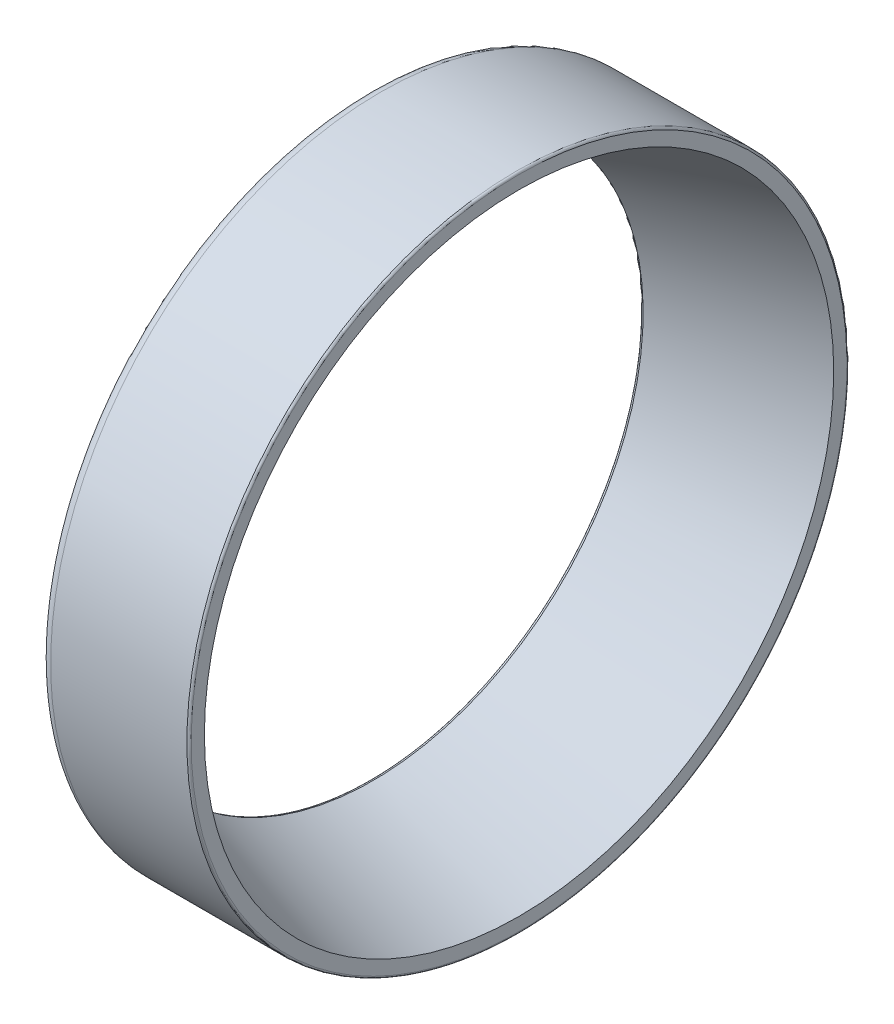
ISO-10303-21;
HEADER;
FILE_DESCRIPTION(('STEP AP214'),'2;1');
FILE_NAME('part.step','',(''),(''),'','','');
FILE_SCHEMA(('AUTOMOTIVE_DESIGN { 1 0 10303 214 1 1 1 1 }'));
ENDSEC;
DATA;
#1=APPLICATION_CONTEXT('core data for automotive mechanical design processes');
#2=APPLICATION_PROTOCOL_DEFINITION('international standard','automotive_design',2000,#1);
#3=PRODUCT_CONTEXT('',#1,'mechanical');
#4=PRODUCT('Part','Part','',(#3));
#5=PRODUCT_RELATED_PRODUCT_CATEGORY('part','',(#4));
#6=PRODUCT_DEFINITION_FORMATION('','',#4);
#7=PRODUCT_DEFINITION_CONTEXT('part definition',#1,'design');
#8=PRODUCT_DEFINITION('design','',#6,#7);
#9=PRODUCT_DEFINITION_SHAPE('','',#8);
#10=(LENGTH_UNIT() NAMED_UNIT(*) SI_UNIT(.MILLI.,.METRE.));
#11=(NAMED_UNIT(*) PLANE_ANGLE_UNIT() SI_UNIT($,.RADIAN.));
#12=(NAMED_UNIT(*) SI_UNIT($,.STERADIAN.) SOLID_ANGLE_UNIT());
#13=UNCERTAINTY_MEASURE_WITH_UNIT(LENGTH_MEASURE(1.E-05),#10,'distance_accuracy_value','');
#14=(GEOMETRIC_REPRESENTATION_CONTEXT(3) GLOBAL_UNCERTAINTY_ASSIGNED_CONTEXT((#13)) GLOBAL_UNIT_ASSIGNED_CONTEXT((#10,
#11,#12)) REPRESENTATION_CONTEXT('',''));
#15=CARTESIAN_POINT('',(0.,0.,0.));
#16=DIRECTION('',(0.,0.,1.));
#17=DIRECTION('',(1.,0.,0.));
#18=AXIS2_PLACEMENT_3D('',#15,#16,#17);
#19=CARTESIAN_POINT('',(0.2,0.,0.));
#20=DIRECTION('',(1.,0.,0.));
#21=DIRECTION('',(0.,0.,-1.));
#22=AXIS2_PLACEMENT_3D('',#19,#20,#21);
#23=TOROIDAL_SURFACE('',#22,25.5912249356796,0.2);
#24=CARTESIAN_POINT('',(0.257916625084482,0.,0.));
#25=DIRECTION('',(1.,0.,0.));
#26=DIRECTION('',(0.,1.,0.));
#27=AXIS2_PLACEMENT_3D('',#24,#25,#26);
#28=CIRCLE('',#27,25.3997943620013);
#29=CARTESIAN_POINT('',(0.257916625084482,25.3997943620013,0.));
#30=VERTEX_POINT('',#29);
#31=EDGE_CURVE('E11',#30,#30,#28,.T.);
#32=ORIENTED_EDGE('',*,*,#31,.T.);
#33=EDGE_LOOP('',(#32));
#34=FACE_BOUND('',#33,.T.);
#35=CARTESIAN_POINT('',(0.,0.,0.));
#36=DIRECTION('',(1.,0.,0.));
#37=DIRECTION('',(0.,1.,0.));
#38=AXIS2_PLACEMENT_3D('',#35,#36,#37);
#39=CIRCLE('',#38,25.5912249356796);
#40=CARTESIAN_POINT('',(0.,25.5912249356796,0.));
#41=VERTEX_POINT('',#40);
#42=EDGE_CURVE('E47',#41,#41,#39,.T.);
#43=ORIENTED_EDGE('',*,*,#42,.F.);
#44=EDGE_LOOP('',(#43));
#45=FACE_BOUND('',#44,.T.);
#46=ADVANCED_FACE('F17',(#34,#45),#23,.T.);
#47=CARTESIAN_POINT('',(7.12895831254224,0.,0.));
#48=DIRECTION('',(1.,0.,0.));
#49=DIRECTION('',(0.,1.,0.));
#50=AXIS2_PLACEMENT_3D('',#47,#48,#49);
#51=CONICAL_SURFACE('',#50,27.4786030794686,0.293791272988206);
#52=CARTESIAN_POINT('',(14.,0.,0.));
#53=DIRECTION('',(1.,0.,0.));
#54=DIRECTION('',(0.,1.,0.));
#55=AXIS2_PLACEMENT_3D('',#52,#53,#54);
#56=CIRCLE('',#55,29.5574117969359);
#57=CARTESIAN_POINT('',(14.,29.5574117969359,0.));
#58=VERTEX_POINT('',#57);
#59=EDGE_CURVE('E20',#58,#58,#56,.T.);
#60=ORIENTED_EDGE('',*,*,#59,.T.);
#61=EDGE_LOOP('',(#60));
#62=FACE_BOUND('',#61,.T.);
#63=ORIENTED_EDGE('',*,*,#31,.F.);
#64=EDGE_LOOP('',(#63));
#65=FACE_BOUND('',#64,.T.);
#66=ADVANCED_FACE('F83',(#62,#65),#51,.F.);
#67=CARTESIAN_POINT('',(14.,30.1787058984679,0.));
#68=DIRECTION('',(1.,0.,0.));
#69=DIRECTION('',(0.,1.,0.));
#70=AXIS2_PLACEMENT_3D('',#67,#68,#69);
#71=PLANE('',#70);
#72=CARTESIAN_POINT('',(14.,0.,0.));
#73=DIRECTION('',(1.,0.,0.));
#74=DIRECTION('',(0.,1.,0.));
#75=AXIS2_PLACEMENT_3D('',#72,#73,#74);
#76=CIRCLE('',#75,30.8);
#77=CARTESIAN_POINT('',(14.,30.8,0.));
#78=VERTEX_POINT('',#77);
#79=EDGE_CURVE('E59',#78,#78,#76,.T.);
#80=ORIENTED_EDGE('',*,*,#79,.T.);
#81=EDGE_LOOP('',(#80));
#82=FACE_BOUND('',#81,.T.);
#83=ORIENTED_EDGE('',*,*,#59,.F.);
#84=EDGE_LOOP('',(#83));
#85=FACE_BOUND('',#84,.T.);
#86=ADVANCED_FACE('F78',(#82,#85),#71,.T.);
#87=CARTESIAN_POINT('',(13.8,0.,0.));
#88=DIRECTION('',(1.,0.,0.));
#89=DIRECTION('',(0.,0.,-1.));
#90=AXIS2_PLACEMENT_3D('',#87,#88,#89);
#91=TOROIDAL_SURFACE('',#90,30.8,0.2);
#92=CARTESIAN_POINT('',(13.8,0.,0.));
#93=DIRECTION('',(1.,0.,0.));
#94=DIRECTION('',(0.,1.,0.));
#95=AXIS2_PLACEMENT_3D('',#92,#93,#94);
#96=CIRCLE('',#95,31.);
#97=CARTESIAN_POINT('',(13.8,31.,0.));
#98=VERTEX_POINT('',#97);
#99=EDGE_CURVE('E62',#98,#98,#96,.T.);
#100=ORIENTED_EDGE('',*,*,#99,.T.);
#101=EDGE_LOOP('',(#100));
#102=FACE_BOUND('',#101,.T.);
#103=ORIENTED_EDGE('',*,*,#79,.F.);
#104=EDGE_LOOP('',(#103));
#105=FACE_BOUND('',#104,.T.);
#106=ADVANCED_FACE('F65',(#102,#105),#91,.T.);
#107=CARTESIAN_POINT('',(7.4,0.,0.));
#108=DIRECTION('',(-1.,0.,0.));
#109=DIRECTION('',(0.,1.,0.));
#110=AXIS2_PLACEMENT_3D('',#107,#108,#109);
#111=CYLINDRICAL_SURFACE('',#110,31.);
#112=CARTESIAN_POINT('',(1.,0.,0.));
#113=DIRECTION('',(1.,0.,0.));
#114=DIRECTION('',(0.,1.,0.));
#115=AXIS2_PLACEMENT_3D('',#112,#113,#114);
#116=CIRCLE('',#115,31.);
#117=CARTESIAN_POINT('',(1.,31.,0.));
#118=VERTEX_POINT('',#117);
#119=EDGE_CURVE('E40',#118,#118,#116,.T.);
#120=ORIENTED_EDGE('',*,*,#119,.T.);
#121=EDGE_LOOP('',(#120));
#122=FACE_BOUND('',#121,.T.);
#123=ORIENTED_EDGE('',*,*,#99,.F.);
#124=EDGE_LOOP('',(#123));
#125=FACE_BOUND('',#124,.T.);
#126=ADVANCED_FACE('F68',(#122,#125),#111,.T.);
#127=CARTESIAN_POINT('',(1.,0.,0.));
#128=DIRECTION('',(1.,0.,0.));
#129=DIRECTION('',(0.,0.,-1.));
#130=AXIS2_PLACEMENT_3D('',#127,#128,#129);
#131=TOROIDAL_SURFACE('',#130,30.,1.);
#132=CARTESIAN_POINT('',(0.,0.,0.));
#133=DIRECTION('',(1.,0.,0.));
#134=DIRECTION('',(0.,1.,0.));
#135=AXIS2_PLACEMENT_3D('',#132,#133,#134);
#136=CIRCLE('',#135,30.);
#137=CARTESIAN_POINT('',(0.,30.,0.));
#138=VERTEX_POINT('',#137);
#139=EDGE_CURVE('E52',#138,#138,#136,.T.);
#140=ORIENTED_EDGE('',*,*,#139,.T.);
#141=EDGE_LOOP('',(#140));
#142=FACE_BOUND('',#141,.T.);
#143=ORIENTED_EDGE('',*,*,#119,.F.);
#144=EDGE_LOOP('',(#143));
#145=FACE_BOUND('',#144,.T.);
#146=ADVANCED_FACE('F53',(#142,#145),#131,.T.);
#147=CARTESIAN_POINT('',(0.,27.7956124678398,0.));
#148=DIRECTION('',(-1.,0.,0.));
#149=DIRECTION('',(0.,-1.,0.));
#150=AXIS2_PLACEMENT_3D('',#147,#148,#149);
#151=PLANE('',#150);
#152=ORIENTED_EDGE('',*,*,#42,.T.);
#153=EDGE_LOOP('',(#152));
#154=FACE_BOUND('',#153,.T.);
#155=ORIENTED_EDGE('',*,*,#139,.F.);
#156=EDGE_LOOP('',(#155));
#157=FACE_BOUND('',#156,.T.);
#158=ADVANCED_FACE('F76',(#154,#157),#151,.T.);
#159=CLOSED_SHELL('',(#46,#66,#86,#106,#126,#146,#158));
#160=MANIFOLD_SOLID_BREP('B1',#159);
#161=ADVANCED_BREP_SHAPE_REPRESENTATION('',(#18,#160),#14);
#162=SHAPE_DEFINITION_REPRESENTATION(#9,#161);
ENDSEC;
END-ISO-10303-21;
